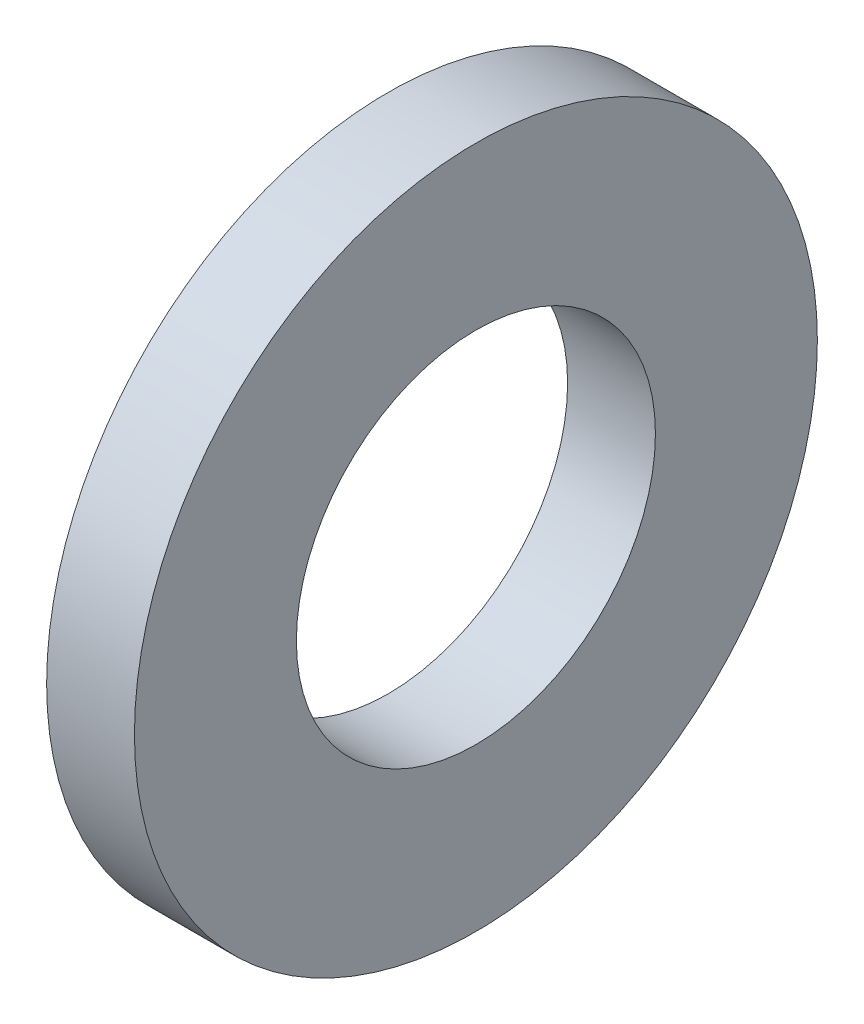
ISO-10303-21;
HEADER;
FILE_DESCRIPTION(('STEP AP214'),'2;1');
FILE_NAME('part.step','',(''),(''),'','','');
FILE_SCHEMA(('AUTOMOTIVE_DESIGN { 1 0 10303 214 1 1 1 1 }'));
ENDSEC;
DATA;
#1=APPLICATION_CONTEXT('core data for automotive mechanical design processes');
#2=APPLICATION_PROTOCOL_DEFINITION('international standard','automotive_design',2000,#1);
#3=PRODUCT_CONTEXT('',#1,'mechanical');
#4=PRODUCT('Part','Part','',(#3));
#5=PRODUCT_RELATED_PRODUCT_CATEGORY('part','',(#4));
#6=PRODUCT_DEFINITION_FORMATION('','',#4);
#7=PRODUCT_DEFINITION_CONTEXT('part definition',#1,'design');
#8=PRODUCT_DEFINITION('design','',#6,#7);
#9=PRODUCT_DEFINITION_SHAPE('','',#8);
#10=(LENGTH_UNIT() NAMED_UNIT(*) SI_UNIT(.MILLI.,.METRE.));
#11=(NAMED_UNIT(*) PLANE_ANGLE_UNIT() SI_UNIT($,.RADIAN.));
#12=(NAMED_UNIT(*) SI_UNIT($,.STERADIAN.) SOLID_ANGLE_UNIT());
#13=UNCERTAINTY_MEASURE_WITH_UNIT(LENGTH_MEASURE(1.E-05),#10,'distance_accuracy_value','');
#14=(GEOMETRIC_REPRESENTATION_CONTEXT(3) GLOBAL_UNCERTAINTY_ASSIGNED_CONTEXT((#13)) GLOBAL_UNIT_ASSIGNED_CONTEXT((#10,
#11,#12)) REPRESENTATION_CONTEXT('',''));
#15=CARTESIAN_POINT('',(0.,0.,0.));
#16=DIRECTION('',(0.,0.,1.));
#17=DIRECTION('',(1.,0.,0.));
#18=AXIS2_PLACEMENT_3D('',#15,#16,#17);
#19=CARTESIAN_POINT('',(-34.9249999999999,0.,0.));
#20=DIRECTION('',(-1.,0.,0.));
#21=DIRECTION('',(0.,0.,1.));
#22=AXIS2_PLACEMENT_3D('',#19,#20,#21);
#23=CYLINDRICAL_SURFACE('',#22,1.84);
#24=CARTESIAN_POINT('',(0.,0.,0.));
#25=DIRECTION('',(-1.,0.,0.));
#26=DIRECTION('',(0.,0.,1.));
#27=AXIS2_PLACEMENT_3D('',#24,#25,#26);
#28=CIRCLE('',#27,1.84);
#29=CARTESIAN_POINT('',(0.,0.,1.84));
#30=VERTEX_POINT('',#29);
#31=EDGE_CURVE('E10',#30,#30,#28,.T.);
#32=ORIENTED_EDGE('',*,*,#31,.F.);
#33=EDGE_LOOP('',(#32));
#34=FACE_BOUND('',#33,.T.);
#35=CARTESIAN_POINT('',(-0.899999999999998,0.,0.));
#36=DIRECTION('',(-1.,0.,0.));
#37=DIRECTION('',(0.,0.,1.));
#38=AXIS2_PLACEMENT_3D('',#35,#36,#37);
#39=CIRCLE('',#38,1.84);
#40=CARTESIAN_POINT('',(-0.899999999999998,0.,1.84));
#41=VERTEX_POINT('',#40);
#42=EDGE_CURVE('E42',#41,#41,#39,.T.);
#43=ORIENTED_EDGE('',*,*,#42,.T.);
#44=EDGE_LOOP('',(#43));
#45=FACE_BOUND('',#44,.T.);
#46=ADVANCED_FACE('F28',(#34,#45),#23,.F.);
#47=CARTESIAN_POINT('',(0.,1.84,0.));
#48=DIRECTION('',(-1.,0.,0.));
#49=DIRECTION('',(0.,0.,1.));
#50=AXIS2_PLACEMENT_3D('',#47,#48,#49);
#51=PLANE('',#50);
#52=CARTESIAN_POINT('',(0.,0.,0.));
#53=DIRECTION('',(-1.,0.,0.));
#54=DIRECTION('',(0.,0.,1.));
#55=AXIS2_PLACEMENT_3D('',#52,#53,#54);
#56=CIRCLE('',#55,3.5);
#57=CARTESIAN_POINT('',(0.,0.,3.5));
#58=VERTEX_POINT('',#57);
#59=EDGE_CURVE('E34',#58,#58,#56,.T.);
#60=ORIENTED_EDGE('',*,*,#59,.F.);
#61=EDGE_LOOP('',(#60));
#62=FACE_BOUND('',#61,.T.);
#63=ORIENTED_EDGE('',*,*,#31,.T.);
#64=EDGE_LOOP('',(#63));
#65=FACE_BOUND('',#64,.T.);
#66=ADVANCED_FACE('F57',(#62,#65),#51,.F.);
#67=CARTESIAN_POINT('',(-34.9249999999999,0.,0.));
#68=DIRECTION('',(-1.,0.,0.));
#69=DIRECTION('',(0.,0.,1.));
#70=AXIS2_PLACEMENT_3D('',#67,#68,#69);
#71=CYLINDRICAL_SURFACE('',#70,3.5);
#72=CARTESIAN_POINT('',(-0.899999999999998,0.,0.));
#73=DIRECTION('',(-1.,0.,0.));
#74=DIRECTION('',(0.,0.,1.));
#75=AXIS2_PLACEMENT_3D('',#72,#73,#74);
#76=CIRCLE('',#75,3.5);
#77=CARTESIAN_POINT('',(-0.899999999999998,0.,3.5));
#78=VERTEX_POINT('',#77);
#79=EDGE_CURVE('E38',#78,#78,#76,.T.);
#80=ORIENTED_EDGE('',*,*,#79,.F.);
#81=EDGE_LOOP('',(#80));
#82=FACE_BOUND('',#81,.T.);
#83=ORIENTED_EDGE('',*,*,#59,.T.);
#84=EDGE_LOOP('',(#83));
#85=FACE_BOUND('',#84,.T.);
#86=ADVANCED_FACE('F52',(#82,#85),#71,.T.);
#87=CARTESIAN_POINT('',(-0.899999999999999,3.5,0.));
#88=DIRECTION('',(1.,0.,0.));
#89=DIRECTION('',(0.,0.,-1.));
#90=AXIS2_PLACEMENT_3D('',#87,#88,#89);
#91=PLANE('',#90);
#92=ORIENTED_EDGE('',*,*,#42,.F.);
#93=EDGE_LOOP('',(#92));
#94=FACE_BOUND('',#93,.T.);
#95=ORIENTED_EDGE('',*,*,#79,.T.);
#96=EDGE_LOOP('',(#95));
#97=FACE_BOUND('',#96,.T.);
#98=ADVANCED_FACE('F49',(#94,#97),#91,.F.);
#99=CLOSED_SHELL('',(#46,#66,#86,#98));
#100=MANIFOLD_SOLID_BREP('B2',#99);
#101=ADVANCED_BREP_SHAPE_REPRESENTATION('',(#18,#100),#14);
#102=SHAPE_DEFINITION_REPRESENTATION(#9,#101);
ENDSEC;
END-ISO-10303-21;
